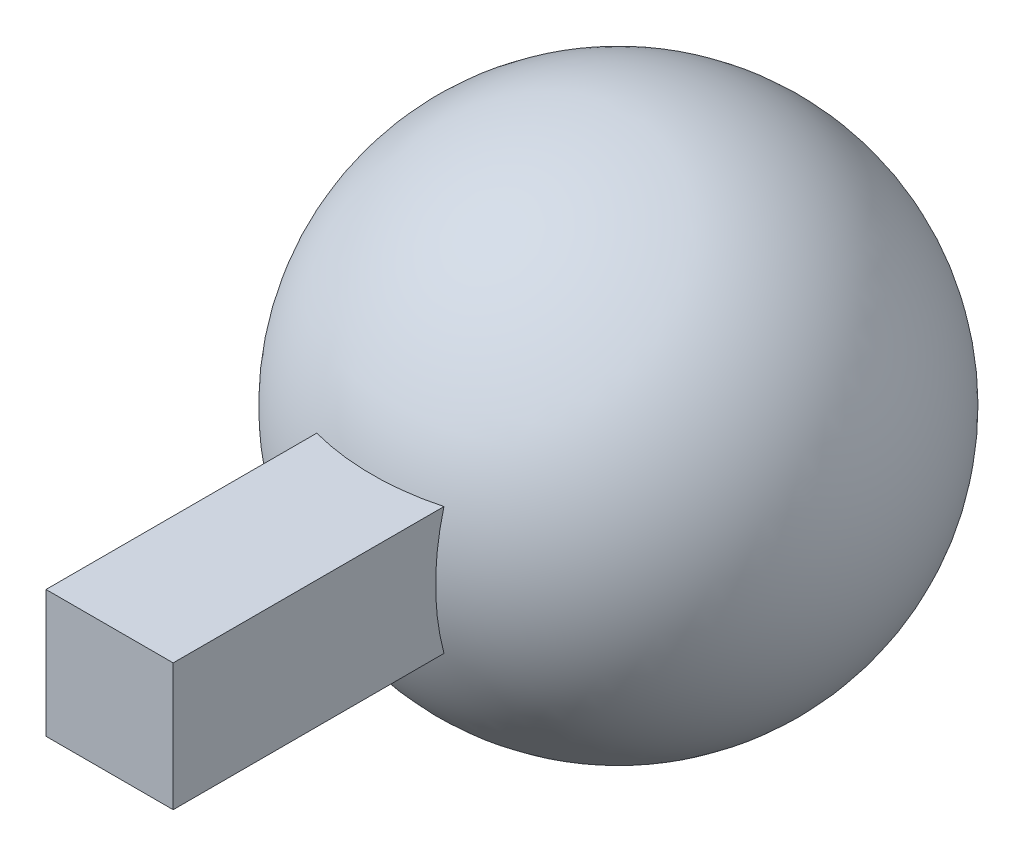
ISO-10303-21;
HEADER;
FILE_DESCRIPTION(('STEP AP214'),'2;1');
FILE_NAME('part.step','',(''),(''),'','','');
FILE_SCHEMA(('AUTOMOTIVE_DESIGN { 1 0 10303 214 1 1 1 1 }'));
ENDSEC;
DATA;
#1=APPLICATION_CONTEXT('core data for automotive mechanical design processes');
#2=APPLICATION_PROTOCOL_DEFINITION('international standard','automotive_design',2000,#1);
#3=PRODUCT_CONTEXT('',#1,'mechanical');
#4=PRODUCT('Part','Part','',(#3));
#5=PRODUCT_RELATED_PRODUCT_CATEGORY('part','',(#4));
#6=PRODUCT_DEFINITION_FORMATION('','',#4);
#7=PRODUCT_DEFINITION_CONTEXT('part definition',#1,'design');
#8=PRODUCT_DEFINITION('design','',#6,#7);
#9=PRODUCT_DEFINITION_SHAPE('','',#8);
#10=(LENGTH_UNIT() NAMED_UNIT(*) SI_UNIT(.MILLI.,.METRE.));
#11=(NAMED_UNIT(*) PLANE_ANGLE_UNIT() SI_UNIT($,.RADIAN.));
#12=(NAMED_UNIT(*) SI_UNIT($,.STERADIAN.) SOLID_ANGLE_UNIT());
#13=UNCERTAINTY_MEASURE_WITH_UNIT(LENGTH_MEASURE(1.E-05),#10,'distance_accuracy_value','');
#14=(GEOMETRIC_REPRESENTATION_CONTEXT(3) GLOBAL_UNCERTAINTY_ASSIGNED_CONTEXT((#13)) GLOBAL_UNIT_ASSIGNED_CONTEXT((#10,
#11,#12)) REPRESENTATION_CONTEXT('',''));
#15=CARTESIAN_POINT('',(0.,0.,0.));
#16=DIRECTION('',(0.,0.,1.));
#17=DIRECTION('',(1.,0.,0.));
#18=AXIS2_PLACEMENT_3D('',#15,#16,#17);
#19=CARTESIAN_POINT('',(-1.,1.,8.));
#20=DIRECTION('',(1.,0.,0.));
#21=DIRECTION('',(0.,1.,0.));
#22=AXIS2_PLACEMENT_3D('',#19,#20,#21);
#23=PLANE('',#22);
#24=CARTESIAN_POINT('',(-1.,0.,0.));
#25=DIRECTION('',(1.,0.,0.));
#26=DIRECTION('',(0.,1.,0.));
#27=AXIS2_PLACEMENT_3D('',#24,#25,#26);
#28=CIRCLE('',#27,3.87298334620742);
#29=CARTESIAN_POINT('',(-1.,-1.,3.74165738677394));
#30=VERTEX_POINT('',#29);
#31=CARTESIAN_POINT('',(-1.,1.,3.74165738677394));
#32=VERTEX_POINT('',#31);
#33=EDGE_CURVE('E11',#30,#32,#28,.F.);
#34=ORIENTED_EDGE('',*,*,#33,.F.);
#35=DIRECTION('',(0.,0.,-1.));
#36=VECTOR('',#35,1.);
#37=CARTESIAN_POINT('',(-1.,-1.,8.));
#38=LINE('',#37,#36);
#39=CARTESIAN_POINT('',(-1.,-1.,8.));
#40=VERTEX_POINT('',#39);
#41=EDGE_CURVE('E75',#40,#30,#38,.T.);
#42=ORIENTED_EDGE('',*,*,#41,.F.);
#43=DIRECTION('',(0.,-1.,0.));
#44=VECTOR('',#43,1.);
#45=CARTESIAN_POINT('',(-1.,1.,8.));
#46=LINE('',#45,#44);
#47=CARTESIAN_POINT('',(-1.,1.,8.));
#48=VERTEX_POINT('',#47);
#49=EDGE_CURVE('E82',#48,#40,#46,.T.);
#50=ORIENTED_EDGE('',*,*,#49,.F.);
#51=DIRECTION('',(0.,0.,-1.));
#52=VECTOR('',#51,1.);
#53=CARTESIAN_POINT('',(-1.,1.,8.));
#54=LINE('',#53,#52);
#55=EDGE_CURVE('E102',#48,#32,#54,.T.);
#56=ORIENTED_EDGE('',*,*,#55,.T.);
#57=EDGE_LOOP('',(#34,#42,#50,#56));
#58=FACE_BOUND('',#57,.T.);
#59=ADVANCED_FACE('F31',(#58),#23,.F.);
#60=CARTESIAN_POINT('',(-1.,-1.,8.));
#61=DIRECTION('',(0.,1.,0.));
#62=DIRECTION('',(0.,0.,1.));
#63=AXIS2_PLACEMENT_3D('',#60,#61,#62);
#64=PLANE('',#63);
#65=CARTESIAN_POINT('',(0.,-1.,0.));
#66=DIRECTION('',(0.,1.,0.));
#67=DIRECTION('',(0.,0.,1.));
#68=AXIS2_PLACEMENT_3D('',#65,#66,#67);
#69=CIRCLE('',#68,3.87298334620742);
#70=CARTESIAN_POINT('',(1.,-1.,3.74165738677394));
#71=VERTEX_POINT('',#70);
#72=EDGE_CURVE('E39',#71,#30,#69,.F.);
#73=ORIENTED_EDGE('',*,*,#72,.F.);
#74=DIRECTION('',(0.,0.,-1.));
#75=VECTOR('',#74,1.);
#76=CARTESIAN_POINT('',(1.,-1.,8.));
#77=LINE('',#76,#75);
#78=CARTESIAN_POINT('',(1.,-1.,8.));
#79=VERTEX_POINT('',#78);
#80=EDGE_CURVE('E78',#79,#71,#77,.T.);
#81=ORIENTED_EDGE('',*,*,#80,.F.);
#82=DIRECTION('',(1.,0.,0.));
#83=VECTOR('',#82,1.);
#84=CARTESIAN_POINT('',(-1.,-1.,8.));
#85=LINE('',#84,#83);
#86=EDGE_CURVE('E72',#40,#79,#85,.T.);
#87=ORIENTED_EDGE('',*,*,#86,.F.);
#88=ORIENTED_EDGE('',*,*,#41,.T.);
#89=EDGE_LOOP('',(#73,#81,#87,#88));
#90=FACE_BOUND('',#89,.T.);
#91=ADVANCED_FACE('F74',(#90),#64,.F.);
#92=CARTESIAN_POINT('',(1.,1.,8.));
#93=DIRECTION('',(-1.,0.,0.));
#94=DIRECTION('',(0.,-1.,0.));
#95=AXIS2_PLACEMENT_3D('',#92,#93,#94);
#96=PLANE('',#95);
#97=CARTESIAN_POINT('',(1.,0.,0.));
#98=DIRECTION('',(-1.,0.,0.));
#99=DIRECTION('',(0.,-1.,0.));
#100=AXIS2_PLACEMENT_3D('',#97,#98,#99);
#101=CIRCLE('',#100,3.87298334620742);
#102=CARTESIAN_POINT('',(1.,1.,3.74165738677394));
#103=VERTEX_POINT('',#102);
#104=EDGE_CURVE('E92',#103,#71,#101,.F.);
#105=ORIENTED_EDGE('',*,*,#104,.F.);
#106=DIRECTION('',(0.,0.,-1.));
#107=VECTOR('',#106,1.);
#108=CARTESIAN_POINT('',(1.,1.,8.));
#109=LINE('',#108,#107);
#110=CARTESIAN_POINT('',(1.,1.,8.));
#111=VERTEX_POINT('',#110);
#112=EDGE_CURVE('E46',#111,#103,#109,.T.);
#113=ORIENTED_EDGE('',*,*,#112,.F.);
#114=DIRECTION('',(0.,1.,0.));
#115=VECTOR('',#114,1.);
#116=CARTESIAN_POINT('',(1.,1.,8.));
#117=LINE('',#116,#115);
#118=EDGE_CURVE('E81',#79,#111,#117,.T.);
#119=ORIENTED_EDGE('',*,*,#118,.F.);
#120=ORIENTED_EDGE('',*,*,#80,.T.);
#121=EDGE_LOOP('',(#105,#113,#119,#120));
#122=FACE_BOUND('',#121,.T.);
#123=ADVANCED_FACE('F100',(#122),#96,.F.);
#124=CARTESIAN_POINT('',(-1.,1.,8.));
#125=DIRECTION('',(0.,-1.,0.));
#126=DIRECTION('',(0.,0.,-1.));
#127=AXIS2_PLACEMENT_3D('',#124,#125,#126);
#128=PLANE('',#127);
#129=CARTESIAN_POINT('',(0.,1.,0.));
#130=DIRECTION('',(0.,-1.,0.));
#131=DIRECTION('',(0.,0.,-1.));
#132=AXIS2_PLACEMENT_3D('',#129,#130,#131);
#133=CIRCLE('',#132,3.87298334620742);
#134=EDGE_CURVE('E89',#32,#103,#133,.F.);
#135=ORIENTED_EDGE('',*,*,#134,.F.);
#136=ORIENTED_EDGE('',*,*,#55,.F.);
#137=DIRECTION('',(-1.,0.,0.));
#138=VECTOR('',#137,1.);
#139=CARTESIAN_POINT('',(-1.,1.,8.));
#140=LINE('',#139,#138);
#141=EDGE_CURVE('E86',#111,#48,#140,.T.);
#142=ORIENTED_EDGE('',*,*,#141,.F.);
#143=ORIENTED_EDGE('',*,*,#112,.T.);
#144=EDGE_LOOP('',(#135,#136,#142,#143));
#145=FACE_BOUND('',#144,.T.);
#146=ADVANCED_FACE('F105',(#145),#128,.F.);
#147=CARTESIAN_POINT('',(-1.,-1.,8.));
#148=DIRECTION('',(0.,0.,1.));
#149=DIRECTION('',(1.,0.,0.));
#150=AXIS2_PLACEMENT_3D('',#147,#148,#149);
#151=PLANE('',#150);
#152=ORIENTED_EDGE('',*,*,#49,.T.);
#153=ORIENTED_EDGE('',*,*,#86,.T.);
#154=ORIENTED_EDGE('',*,*,#118,.T.);
#155=ORIENTED_EDGE('',*,*,#141,.T.);
#156=EDGE_LOOP('',(#152,#153,#154,#155));
#157=FACE_BOUND('',#156,.T.);
#158=ADVANCED_FACE('F85',(#157),#151,.T.);
#159=CARTESIAN_POINT('',(0.,0.,0.));
#160=DIRECTION('',(0.,1.,0.));
#161=DIRECTION('',(1.,0.,0.));
#162=AXIS2_PLACEMENT_3D('',#159,#160,#161);
#163=SPHERICAL_SURFACE('',#162,4.);
#164=ORIENTED_EDGE('',*,*,#72,.T.);
#165=ORIENTED_EDGE('',*,*,#33,.T.);
#166=ORIENTED_EDGE('',*,*,#134,.T.);
#167=ORIENTED_EDGE('',*,*,#104,.T.);
#168=EDGE_LOOP('',(#164,#165,#166,#167));
#169=FACE_BOUND('',#168,.T.);
#170=ADVANCED_FACE('F33',(#169),#163,.T.);
#171=CLOSED_SHELL('',(#59,#91,#123,#146,#158,#170));
#172=MANIFOLD_SOLID_BREP('B2',#171);
#173=ADVANCED_BREP_SHAPE_REPRESENTATION('',(#18,#172),#14);
#174=SHAPE_DEFINITION_REPRESENTATION(#9,#173);
ENDSEC;
END-ISO-10303-21;
